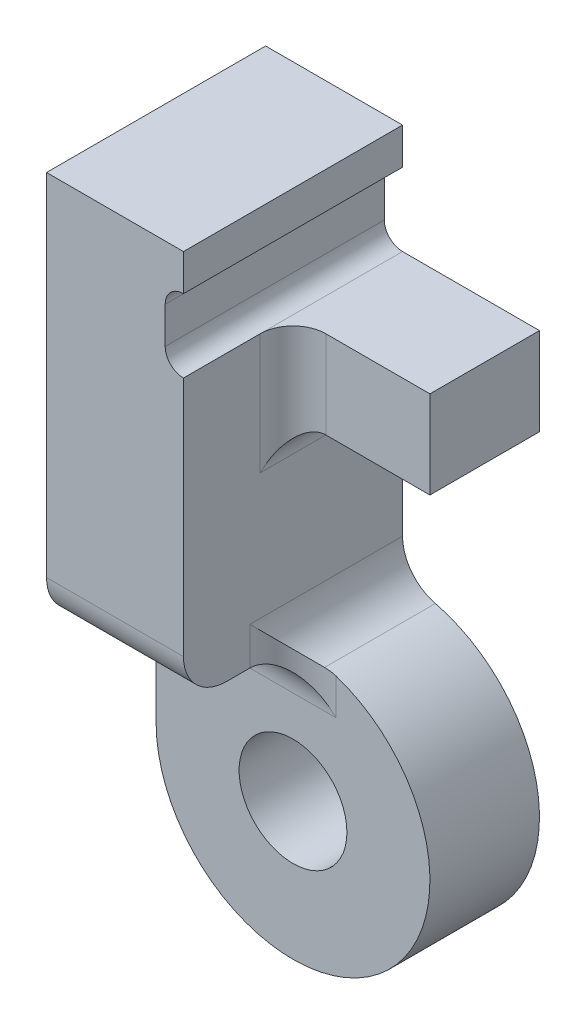
ISO-10303-21;
HEADER;
FILE_DESCRIPTION(('STEP AP214'),'2;1');
FILE_NAME('part.step','',(''),(''),'','','');
FILE_SCHEMA(('AUTOMOTIVE_DESIGN { 1 0 10303 214 1 1 1 1 }'));
ENDSEC;
DATA;
#1=APPLICATION_CONTEXT('core data for automotive mechanical design processes');
#2=APPLICATION_PROTOCOL_DEFINITION('international standard','automotive_design',2000,#1);
#3=PRODUCT_CONTEXT('',#1,'mechanical');
#4=PRODUCT('Part','Part','',(#3));
#5=PRODUCT_RELATED_PRODUCT_CATEGORY('part','',(#4));
#6=PRODUCT_DEFINITION_FORMATION('','',#4);
#7=PRODUCT_DEFINITION_CONTEXT('part definition',#1,'design');
#8=PRODUCT_DEFINITION('design','',#6,#7);
#9=PRODUCT_DEFINITION_SHAPE('','',#8);
#10=(LENGTH_UNIT() NAMED_UNIT(*) SI_UNIT(.MILLI.,.METRE.));
#11=(NAMED_UNIT(*) PLANE_ANGLE_UNIT() SI_UNIT($,.RADIAN.));
#12=(NAMED_UNIT(*) SI_UNIT($,.STERADIAN.) SOLID_ANGLE_UNIT());
#13=UNCERTAINTY_MEASURE_WITH_UNIT(LENGTH_MEASURE(1.E-05),#10,'distance_accuracy_value','');
#14=(GEOMETRIC_REPRESENTATION_CONTEXT(3) GLOBAL_UNCERTAINTY_ASSIGNED_CONTEXT((#13)) GLOBAL_UNIT_ASSIGNED_CONTEXT((#10,
#11,#12)) REPRESENTATION_CONTEXT('',''));
#15=CARTESIAN_POINT('',(0.,0.,0.));
#16=DIRECTION('',(0.,0.,1.));
#17=DIRECTION('',(1.,0.,0.));
#18=AXIS2_PLACEMENT_3D('',#15,#16,#17);
#19=CARTESIAN_POINT('',(0.,12.30900002,5.08));
#20=DIRECTION('',(-1.,0.,0.));
#21=DIRECTION('',(0.,-1.,0.));
#22=AXIS2_PLACEMENT_3D('',#19,#20,#21);
#23=PLANE('',#22);
#24=DIRECTION('',(0.,1.,0.));
#25=VECTOR('',#24,1.);
#26=CARTESIAN_POINT('',(0.,12.30900002,5.08));
#27=LINE('',#26,#25);
#28=CARTESIAN_POINT('',(0.,11.4623333533333,5.08));
#29=VERTEX_POINT('',#28);
#30=CARTESIAN_POINT('',(0.,12.30900002,5.08));
#31=VERTEX_POINT('',#30);
#32=EDGE_CURVE('E235',#29,#31,#27,.T.);
#33=ORIENTED_EDGE('',*,*,#32,.F.);
#34=DIRECTION('',(0.,0.,-1.));
#35=VECTOR('',#34,1.);
#36=CARTESIAN_POINT('',(0.,11.4623333533333,5.081));
#37=LINE('',#36,#35);
#38=CARTESIAN_POINT('',(0.,11.4623333533333,0.));
#39=VERTEX_POINT('',#38);
#40=EDGE_CURVE('E220',#39,#29,#37,.F.);
#41=ORIENTED_EDGE('',*,*,#40,.F.);
#42=DIRECTION('',(0.,1.,0.));
#43=VECTOR('',#42,1.);
#44=CARTESIAN_POINT('',(0.,12.30900002,0.));
#45=LINE('',#44,#43);
#46=CARTESIAN_POINT('',(0.,12.30900002,0.));
#47=VERTEX_POINT('',#46);
#48=EDGE_CURVE('E233',#39,#47,#45,.T.);
#49=ORIENTED_EDGE('',*,*,#48,.T.);
#50=DIRECTION('',(0.,0.,-1.));
#51=VECTOR('',#50,1.);
#52=CARTESIAN_POINT('',(0.,12.30900002,5.08));
#53=LINE('',#52,#51);
#54=EDGE_CURVE('E261',#31,#47,#53,.T.);
#55=ORIENTED_EDGE('',*,*,#54,.F.);
#56=EDGE_LOOP('',(#33,#41,#49,#55));
#57=FACE_BOUND('',#56,.T.);
#58=ADVANCED_FACE('F33',(#57),#23,.F.);
#59=CARTESIAN_POINT('',(0.,0.,5.08));
#60=DIRECTION('',(0.,0.,1.));
#61=DIRECTION('',(1.,0.,0.));
#62=AXIS2_PLACEMENT_3D('',#59,#60,#61);
#63=PLANE('',#62);
#64=DIRECTION('',(0.,-1.,0.));
#65=VECTOR('',#64,1.);
#66=CARTESIAN_POINT('',(-3.175,0.,5.08));
#67=LINE('',#66,#65);
#68=CARTESIAN_POINT('',(-3.175,12.30900002,5.08));
#69=VERTEX_POINT('',#68);
#70=CARTESIAN_POINT('',(-3.175,4.175,5.08));
#71=VERTEX_POINT('',#70);
#72=EDGE_CURVE('E258',#69,#71,#67,.T.);
#73=ORIENTED_EDGE('',*,*,#72,.T.);
#74=DIRECTION('',(-1.,0.,0.));
#75=VECTOR('',#74,1.);
#76=CARTESIAN_POINT('',(0.,4.175,5.08));
#77=LINE('',#76,#75);
#78=CARTESIAN_POINT('',(0.,4.175,5.08));
#79=VERTEX_POINT('',#78);
#80=EDGE_CURVE('E331',#71,#79,#77,.F.);
#81=ORIENTED_EDGE('',*,*,#80,.T.);
#82=CARTESIAN_POINT('',(0.,9.76900002,5.08));
#83=VERTEX_POINT('',#82);
#84=EDGE_CURVE('E522',#79,#83,#27,.T.);
#85=ORIENTED_EDGE('',*,*,#84,.T.);
#86=CARTESIAN_POINT('',(0.,10.1923333533333,5.08));
#87=DIRECTION('',(0.,0.,1.));
#88=DIRECTION('',(1.,0.,0.));
#89=AXIS2_PLACEMENT_3D('',#86,#87,#88);
#90=CIRCLE('',#89,0.423333333333334);
#91=CARTESIAN_POINT('',(-0.423333333333334,10.1923333533333,5.08));
#92=VERTEX_POINT('',#91);
#93=EDGE_CURVE('E457',#83,#92,#90,.F.);
#94=ORIENTED_EDGE('',*,*,#93,.T.);
#95=DIRECTION('',(0.,1.,0.));
#96=VECTOR('',#95,1.);
#97=CARTESIAN_POINT('',(-0.423333333333334,11.03900002,5.08));
#98=LINE('',#97,#96);
#99=CARTESIAN_POINT('',(-0.423333333333334,11.03900002,5.08));
#100=VERTEX_POINT('',#99);
#101=EDGE_CURVE('E236',#92,#100,#98,.T.);
#102=ORIENTED_EDGE('',*,*,#101,.T.);
#103=CARTESIAN_POINT('',(0.,11.03900002,5.08));
#104=DIRECTION('',(0.,0.,1.));
#105=DIRECTION('',(1.,0.,0.));
#106=AXIS2_PLACEMENT_3D('',#103,#104,#105);
#107=CIRCLE('',#106,0.423333333333334);
#108=EDGE_CURVE('E228',#100,#29,#107,.F.);
#109=ORIENTED_EDGE('',*,*,#108,.T.);
#110=ORIENTED_EDGE('',*,*,#32,.T.);
#111=DIRECTION('',(-1.,0.,0.));
#112=VECTOR('',#111,1.);
#113=CARTESIAN_POINT('',(-3.175,12.30900002,5.08));
#114=LINE('',#113,#112);
#115=EDGE_CURVE('E524',#31,#69,#114,.T.);
#116=ORIENTED_EDGE('',*,*,#115,.T.);
#117=EDGE_LOOP('',(#73,#81,#85,#94,#102,#109,#110,#116));
#118=FACE_BOUND('',#117,.T.);
#119=ADVANCED_FACE('F361',(#118),#63,.T.);
#120=CARTESIAN_POINT('',(0.,0.,5.08));
#121=DIRECTION('',(0.,0.,-1.));
#122=DIRECTION('',(-1.,0.,0.));
#123=AXIS2_PLACEMENT_3D('',#120,#121,#122);
#124=CYLINDRICAL_SURFACE('',#123,3.175);
#125=CARTESIAN_POINT('',(0.,0.,0.));
#126=DIRECTION('',(0.,0.,1.));
#127=DIRECTION('',(1.,0.,0.));
#128=AXIS2_PLACEMENT_3D('',#125,#126,#127);
#129=CIRCLE('',#128,3.175);
#130=CARTESIAN_POINT('',(-3.175,0.,0.));
#131=VERTEX_POINT('',#130);
#132=CARTESIAN_POINT('',(0.760479041916168,3.08257954103479,0.));
#133=VERTEX_POINT('',#132);
#134=EDGE_CURVE('E245',#131,#133,#129,.T.);
#135=ORIENTED_EDGE('',*,*,#134,.T.);
#136=DIRECTION('',(0.,0.,-1.));
#137=VECTOR('',#136,1.);
#138=CARTESIAN_POINT('',(0.760479041916168,3.08257954103479,5.08));
#139=LINE('',#138,#137);
#140=CARTESIAN_POINT('',(0.760479041916168,3.08257954103479,2.56910880597329));
#141=VERTEX_POINT('',#140);
#142=EDGE_CURVE('E49',#133,#141,#139,.F.);
#143=ORIENTED_EDGE('',*,*,#142,.T.);
#144=CARTESIAN_POINT('',(0.760479041916168,3.08257954103479,2.56910880597329));
#145=CARTESIAN_POINT('',(0.780317963724978,3.07768627749126,2.56421341821076));
#146=CARTESIAN_POINT('',(0.80025299046266,3.07256405721821,2.55994155083488));
#147=CARTESIAN_POINT('',(0.84015372190689,3.06189319968671,2.55265084580708));
#148=CARTESIAN_POINT('',(0.860119018164366,3.05634626700073,2.54962728152229));
#149=CARTESIAN_POINT('',(0.900071162405368,3.04482005823775,2.54480195658036));
#150=CARTESIAN_POINT('',(0.920058009790575,3.03884079387378,2.54300016283588));
#151=CARTESIAN_POINT('',(0.960052532742697,3.02644439034898,2.54059643929719));
#152=CARTESIAN_POINT('',(0.980059994028061,3.02002565926557,2.53999913937271));
#153=CARTESIAN_POINT('',(1.,3.01340753964677,2.54));
#154=B_SPLINE_CURVE_WITH_KNOTS('',3,(#144,#145,#146,#147,#148,#149,#150,#151,#152,#153),
.UNSPECIFIED.,.F.,.F.,(4,2,2,2,4),(0.,0.0630227253916922,0.125804580232714,0.188584734781046,
0.251605749093955),.UNSPECIFIED.);
#155=CARTESIAN_POINT('',(1.,3.01340753964677,2.54));
#156=VERTEX_POINT('',#155);
#157=EDGE_CURVE('E11',#141,#156,#154,.T.);
#158=ORIENTED_EDGE('',*,*,#157,.T.);
#159=CARTESIAN_POINT('',(0.,0.,2.54));
#160=DIRECTION('',(0.,0.,1.));
#161=DIRECTION('',(1.,0.,0.));
#162=AXIS2_PLACEMENT_3D('',#159,#160,#161);
#163=CIRCLE('',#162,3.175);
#164=CARTESIAN_POINT('',(-3.175,0.,2.54));
#165=VERTEX_POINT('',#164);
#166=EDGE_CURVE('E510',#165,#156,#163,.T.);
#167=ORIENTED_EDGE('',*,*,#166,.F.);
#168=DIRECTION('',(0.,0.,-1.));
#169=VECTOR('',#168,1.);
#170=CARTESIAN_POINT('',(-3.175,0.,5.08));
#171=LINE('',#170,#169);
#172=EDGE_CURVE('E255',#165,#131,#171,.T.);
#173=ORIENTED_EDGE('',*,*,#172,.T.);
#174=EDGE_LOOP('',(#135,#143,#158,#167,#173));
#175=FACE_BOUND('',#174,.T.);
#176=ADVANCED_FACE('F355',(#175),#124,.T.);
#177=CARTESIAN_POINT('',(-3.175,0.,5.08));
#178=DIRECTION('',(1.,0.,0.));
#179=DIRECTION('',(0.,0.,-1.));
#180=AXIS2_PLACEMENT_3D('',#177,#178,#179);
#181=PLANE('',#180);
#182=DIRECTION('',(0.,0.,-1.));
#183=VECTOR('',#182,1.);
#184=CARTESIAN_POINT('',(-3.175,3.175,5.081));
#185=LINE('',#184,#183);
#186=CARTESIAN_POINT('',(-3.175,3.175,4.08));
#187=VERTEX_POINT('',#186);
#188=CARTESIAN_POINT('',(-3.175,3.175,3.556));
#189=VERTEX_POINT('',#188);
#190=EDGE_CURVE('E515',#187,#189,#185,.T.);
#191=ORIENTED_EDGE('',*,*,#190,.F.);
#192=CARTESIAN_POINT('',(-3.175,4.175,4.08));
#193=DIRECTION('',(1.,0.,0.));
#194=DIRECTION('',(0.,0.,-1.));
#195=AXIS2_PLACEMENT_3D('',#192,#193,#194);
#196=CIRCLE('',#195,1.);
#197=EDGE_CURVE('E329',#187,#71,#196,.F.);
#198=ORIENTED_EDGE('',*,*,#197,.T.);
#199=ORIENTED_EDGE('',*,*,#72,.F.);
#200=DIRECTION('',(0.,0.,-1.));
#201=VECTOR('',#200,1.);
#202=CARTESIAN_POINT('',(-3.175,12.30900002,5.08));
#203=LINE('',#202,#201);
#204=CARTESIAN_POINT('',(-3.175,12.30900002,0.));
#205=VERTEX_POINT('',#204);
#206=EDGE_CURVE('E257',#69,#205,#203,.T.);
#207=ORIENTED_EDGE('',*,*,#206,.T.);
#208=DIRECTION('',(0.,-1.,0.));
#209=VECTOR('',#208,1.);
#210=CARTESIAN_POINT('',(-3.175,0.,0.));
#211=LINE('',#210,#209);
#212=EDGE_CURVE('E252',#205,#131,#211,.T.);
#213=ORIENTED_EDGE('',*,*,#212,.T.);
#214=ORIENTED_EDGE('',*,*,#172,.F.);
#215=DIRECTION('',(0.,-1.,0.));
#216=VECTOR('',#215,1.);
#217=CARTESIAN_POINT('',(-3.175,3.175,2.54));
#218=LINE('',#217,#216);
#219=CARTESIAN_POINT('',(-3.175,3.20955389820755,2.54));
#220=VERTEX_POINT('',#219);
#221=EDGE_CURVE('E513',#220,#165,#218,.T.);
#222=ORIENTED_EDGE('',*,*,#221,.F.);
#223=CARTESIAN_POINT('',(-3.175,3.20955389820755,1.397));
#224=DIRECTION('',(1.,0.,0.));
#225=DIRECTION('',(0.,0.,-1.));
#226=AXIS2_PLACEMENT_3D('',#223,#224,#225);
#227=CIRCLE('',#226,1.143);
#228=CARTESIAN_POINT('',(-3.175,3.788815989794,2.38234482758621));
#229=VERTEX_POINT('',#228);
#230=EDGE_CURVE('E269',#220,#229,#227,.F.);
#231=ORIENTED_EDGE('',*,*,#230,.T.);
#232=CARTESIAN_POINT('',(-3.175,5.07606508220834,4.572));
#233=DIRECTION('',(1.,0.,0.));
#234=DIRECTION('',(0.,0.,-1.));
#235=AXIS2_PLACEMENT_3D('',#232,#233,#234);
#236=CIRCLE('',#235,2.54);
#237=CARTESIAN_POINT('',(-3.175,5.07606508220834,2.032));
#238=VERTEX_POINT('',#237);
#239=EDGE_CURVE('E282',#229,#238,#236,.T.);
#240=ORIENTED_EDGE('',*,*,#239,.T.);
#241=DIRECTION('',(0.,-1.,0.));
#242=VECTOR('',#241,1.);
#243=CARTESIAN_POINT('',(-3.175,11.29300002,2.032));
#244=LINE('',#243,#242);
#245=CARTESIAN_POINT('',(-3.175,11.29300002,2.032));
#246=VERTEX_POINT('',#245);
#247=EDGE_CURVE('E488',#246,#238,#244,.T.);
#248=ORIENTED_EDGE('',*,*,#247,.F.);
#249=DIRECTION('',(0.,0.,-1.));
#250=VECTOR('',#249,1.);
#251=CARTESIAN_POINT('',(-3.175,11.29300002,3.048));
#252=LINE('',#251,#250);
#253=CARTESIAN_POINT('',(-3.175,11.29300002,3.048));
#254=VERTEX_POINT('',#253);
#255=EDGE_CURVE('E503',#254,#246,#252,.T.);
#256=ORIENTED_EDGE('',*,*,#255,.F.);
#257=DIRECTION('',(0.,1.,0.));
#258=VECTOR('',#257,1.);
#259=CARTESIAN_POINT('',(-3.175,4.191,3.048));
#260=LINE('',#259,#258);
#261=CARTESIAN_POINT('',(-3.175,5.207,3.048));
#262=VERTEX_POINT('',#261);
#263=EDGE_CURVE('E501',#262,#254,#260,.T.);
#264=ORIENTED_EDGE('',*,*,#263,.F.);
#265=CARTESIAN_POINT('',(-3.175,5.207,5.588));
#266=DIRECTION('',(1.,0.,0.));
#267=DIRECTION('',(0.,0.,-1.));
#268=AXIS2_PLACEMENT_3D('',#265,#266,#267);
#269=CIRCLE('',#268,2.54);
#270=CARTESIAN_POINT('',(-3.175,3.91975090758567,3.39834482758621));
#271=VERTEX_POINT('',#270);
#272=EDGE_CURVE('E287',#262,#271,#269,.F.);
#273=ORIENTED_EDGE('',*,*,#272,.T.);
#274=CARTESIAN_POINT('',(-3.175,3.34048881599922,2.413));
#275=DIRECTION('',(1.,0.,0.));
#276=DIRECTION('',(0.,0.,-1.));
#277=AXIS2_PLACEMENT_3D('',#274,#275,#276);
#278=CIRCLE('',#277,1.143);
#279=CARTESIAN_POINT('',(-3.175,3.34048881599922,3.556));
#280=VERTEX_POINT('',#279);
#281=EDGE_CURVE('E299',#271,#280,#278,.T.);
#282=ORIENTED_EDGE('',*,*,#281,.T.);
#283=DIRECTION('',(0.,1.,0.));
#284=VECTOR('',#283,1.);
#285=CARTESIAN_POINT('',(-3.175,3.683,3.556));
#286=LINE('',#285,#284);
#287=EDGE_CURVE('E484',#189,#280,#286,.T.);
#288=ORIENTED_EDGE('',*,*,#287,.F.);
#289=EDGE_LOOP('',(#191,#198,#199,#207,#213,#214,#222,#231,#240,#248,#256,#264,#273,#282,#288));
#290=FACE_BOUND('',#289,.T.);
#291=ADVANCED_FACE('F360',(#290),#181,.F.);
#292=CARTESIAN_POINT('',(0.,0.,5.08));
#293=DIRECTION('',(0.,0.,-1.));
#294=DIRECTION('',(-1.,0.,0.));
#295=AXIS2_PLACEMENT_3D('',#292,#293,#294);
#296=CYLINDRICAL_SURFACE('',#295,1.25);
#297=CARTESIAN_POINT('',(0.,0.,0.));
#298=DIRECTION('',(0.,0.,1.));
#299=DIRECTION('',(1.,0.,0.));
#300=AXIS2_PLACEMENT_3D('',#297,#298,#299);
#301=CIRCLE('',#300,1.25);
#302=CARTESIAN_POINT('',(1.25,0.,0.));
#303=VERTEX_POINT('',#302);
#304=EDGE_CURVE('E247',#303,#303,#301,.T.);
#305=ORIENTED_EDGE('',*,*,#304,.F.);
#306=EDGE_LOOP('',(#305));
#307=FACE_BOUND('',#306,.T.);
#308=CARTESIAN_POINT('',(0.,0.,2.54));
#309=DIRECTION('',(0.,0.,1.));
#310=DIRECTION('',(1.,0.,0.));
#311=AXIS2_PLACEMENT_3D('',#308,#309,#310);
#312=CIRCLE('',#311,1.25);
#313=CARTESIAN_POINT('',(1.25,0.,2.54));
#314=VERTEX_POINT('',#313);
#315=EDGE_CURVE('E517',#314,#314,#312,.F.);
#316=ORIENTED_EDGE('',*,*,#315,.F.);
#317=EDGE_LOOP('',(#316));
#318=FACE_BOUND('',#317,.T.);
#319=ADVANCED_FACE('F427',(#307,#318),#296,.F.);
#320=CARTESIAN_POINT('',(0.,0.,0.));
#321=DIRECTION('',(0.,0.,1.));
#322=DIRECTION('',(1.,0.,0.));
#323=AXIS2_PLACEMENT_3D('',#320,#321,#322);
#324=PLANE('',#323);
#325=ORIENTED_EDGE('',*,*,#48,.F.);
#326=CARTESIAN_POINT('',(0.,11.03900002,0.));
#327=DIRECTION('',(0.,0.,-1.));
#328=DIRECTION('',(-1.,0.,0.));
#329=AXIS2_PLACEMENT_3D('',#326,#327,#328);
#330=CIRCLE('',#329,0.423333333333334);
#331=CARTESIAN_POINT('',(-0.423333333333334,11.03900002,0.));
#332=VERTEX_POINT('',#331);
#333=EDGE_CURVE('E216',#332,#39,#330,.T.);
#334=ORIENTED_EDGE('',*,*,#333,.F.);
#335=DIRECTION('',(0.,1.,0.));
#336=VECTOR('',#335,1.);
#337=CARTESIAN_POINT('',(-0.423333333333334,11.03900002,0.));
#338=LINE('',#337,#336);
#339=CARTESIAN_POINT('',(-0.423333333333334,10.1923333533333,0.));
#340=VERTEX_POINT('',#339);
#341=EDGE_CURVE('E453',#340,#332,#338,.T.);
#342=ORIENTED_EDGE('',*,*,#341,.F.);
#343=CARTESIAN_POINT('',(0.,10.1923333533333,0.));
#344=DIRECTION('',(0.,0.,-1.));
#345=DIRECTION('',(-1.,0.,0.));
#346=AXIS2_PLACEMENT_3D('',#343,#344,#345);
#347=CIRCLE('',#346,0.423333333333334);
#348=CARTESIAN_POINT('',(0.,9.76900002,0.));
#349=VERTEX_POINT('',#348);
#350=EDGE_CURVE('E227',#349,#340,#347,.T.);
#351=ORIENTED_EDGE('',*,*,#350,.F.);
#352=DIRECTION('',(1.,0.,0.));
#353=VECTOR('',#352,1.);
#354=CARTESIAN_POINT('',(3.175,9.76900002,0.));
#355=LINE('',#354,#353);
#356=CARTESIAN_POINT('',(3.175,9.76900002,0.));
#357=VERTEX_POINT('',#356);
#358=EDGE_CURVE('E461',#349,#357,#355,.T.);
#359=ORIENTED_EDGE('',*,*,#358,.T.);
#360=DIRECTION('',(0.,-1.,0.));
#361=VECTOR('',#360,1.);
#362=CARTESIAN_POINT('',(3.175,7.73700002,0.));
#363=LINE('',#362,#361);
#364=CARTESIAN_POINT('',(3.175,7.73700002,0.));
#365=VERTEX_POINT('',#364);
#366=EDGE_CURVE('E466',#357,#365,#363,.T.);
#367=ORIENTED_EDGE('',*,*,#366,.T.);
#368=DIRECTION('',(-1.,0.,0.));
#369=VECTOR('',#368,1.);
#370=CARTESIAN_POINT('',(0.,7.73700002,0.));
#371=LINE('',#370,#369);
#372=CARTESIAN_POINT('',(0.762,7.73700002,0.));
#373=VERTEX_POINT('',#372);
#374=EDGE_CURVE('E462',#365,#373,#371,.T.);
#375=ORIENTED_EDGE('',*,*,#374,.T.);
#376=CARTESIAN_POINT('',(0.762,6.97500002,0.));
#377=DIRECTION('',(0.,0.,1.));
#378=DIRECTION('',(1.,0.,0.));
#379=AXIS2_PLACEMENT_3D('',#376,#377,#378);
#380=CIRCLE('',#379,0.762);
#381=CARTESIAN_POINT('',(0.,6.97500002,0.));
#382=VERTEX_POINT('',#381);
#383=EDGE_CURVE('E313',#373,#382,#380,.T.);
#384=ORIENTED_EDGE('',*,*,#383,.T.);
#385=CARTESIAN_POINT('',(0.,4.0534707350615,0.));
#386=VERTEX_POINT('',#385);
#387=EDGE_CURVE('E244',#386,#382,#45,.T.);
#388=ORIENTED_EDGE('',*,*,#387,.F.);
#389=CARTESIAN_POINT('',(1.,4.0534707350615,0.));
#390=DIRECTION('',(0.,0.,1.));
#391=DIRECTION('',(1.,0.,0.));
#392=AXIS2_PLACEMENT_3D('',#389,#390,#391);
#393=CIRCLE('',#392,1.);
#394=EDGE_CURVE('E337',#386,#133,#393,.T.);
#395=ORIENTED_EDGE('',*,*,#394,.T.);
#396=ORIENTED_EDGE('',*,*,#134,.F.);
#397=ORIENTED_EDGE('',*,*,#212,.F.);
#398=DIRECTION('',(-1.,0.,0.));
#399=VECTOR('',#398,1.);
#400=CARTESIAN_POINT('',(-3.175,12.30900002,0.));
#401=LINE('',#400,#399);
#402=EDGE_CURVE('E243',#47,#205,#401,.T.);
#403=ORIENTED_EDGE('',*,*,#402,.F.);
#404=EDGE_LOOP('',(#325,#334,#342,#351,#359,#367,#375,#384,#388,#395,#396,#397,#403));
#405=FACE_BOUND('',#404,.T.);
#406=ORIENTED_EDGE('',*,*,#304,.T.);
#407=EDGE_LOOP('',(#406));
#408=FACE_BOUND('',#407,.T.);
#409=ADVANCED_FACE('F240',(#405,#408),#324,.F.);
#410=DIRECTION('',(0.,0.,-1.));
#411=VECTOR('',#410,1.);
#412=CARTESIAN_POINT('',(0.,3.175,5.08));
#413=LINE('',#412,#411);
#414=CARTESIAN_POINT('',(0.,3.175,4.08));
#415=VERTEX_POINT('',#414);
#416=CARTESIAN_POINT('',(0.,3.175,3.54));
#417=VERTEX_POINT('',#416);
#418=EDGE_CURVE('E263',#415,#417,#413,.T.);
#419=ORIENTED_EDGE('',*,*,#418,.T.);
#420=DIRECTION('',(0.,1.,0.));
#421=VECTOR('',#420,1.);
#422=CARTESIAN_POINT('',(0.,12.30900002,3.54));
#423=LINE('',#422,#421);
#424=CARTESIAN_POINT('',(0.,4.0534707350615,3.54));
#425=VERTEX_POINT('',#424);
#426=EDGE_CURVE('E346',#417,#425,#423,.T.);
#427=ORIENTED_EDGE('',*,*,#426,.T.);
#428=DIRECTION('',(0.,0.,1.));
#429=VECTOR('',#428,1.);
#430=CARTESIAN_POINT('',(0.,4.0534707350615,0.));
#431=LINE('',#430,#429);
#432=EDGE_CURVE('E56',#425,#386,#431,.F.);
#433=ORIENTED_EDGE('',*,*,#432,.T.);
#434=ORIENTED_EDGE('',*,*,#387,.T.);
#435=DIRECTION('',(0.,0.,-1.));
#436=VECTOR('',#435,1.);
#437=CARTESIAN_POINT('',(0.,6.97500002,5.08));
#438=LINE('',#437,#436);
#439=CARTESIAN_POINT('',(0.,6.97500002,3.302));
#440=VERTEX_POINT('',#439);
#441=EDGE_CURVE('E311',#382,#440,#438,.F.);
#442=ORIENTED_EDGE('',*,*,#441,.T.);
#443=DIRECTION('',(0.,1.,0.));
#444=VECTOR('',#443,1.);
#445=CARTESIAN_POINT('',(0.,12.30900002,3.302));
#446=LINE('',#445,#444);
#447=CARTESIAN_POINT('',(0.,9.76900002,3.302));
#448=VERTEX_POINT('',#447);
#449=EDGE_CURVE('E316',#440,#448,#446,.T.);
#450=ORIENTED_EDGE('',*,*,#449,.T.);
#451=DIRECTION('',(0.,0.,-1.));
#452=VECTOR('',#451,1.);
#453=CARTESIAN_POINT('',(0.,9.76900002,5.081));
#454=LINE('',#453,#452);
#455=EDGE_CURVE('E237',#83,#448,#454,.T.);
#456=ORIENTED_EDGE('',*,*,#455,.F.);
#457=ORIENTED_EDGE('',*,*,#84,.F.);
#458=CARTESIAN_POINT('',(0.,4.175,4.08));
#459=DIRECTION('',(-1.,0.,0.));
#460=DIRECTION('',(0.,-1.,0.));
#461=AXIS2_PLACEMENT_3D('',#458,#459,#460);
#462=CIRCLE('',#461,1.);
#463=EDGE_CURVE('E333',#79,#415,#462,.F.);
#464=ORIENTED_EDGE('',*,*,#463,.T.);
#465=EDGE_LOOP('',(#419,#427,#433,#434,#442,#450,#456,#457,#464));
#466=FACE_BOUND('',#465,.T.);
#467=ADVANCED_FACE('F362',(#466),#23,.F.);
#468=CARTESIAN_POINT('',(-3.175,12.30900002,5.08));
#469=DIRECTION('',(0.,-1.,0.));
#470=DIRECTION('',(0.,0.,-1.));
#471=AXIS2_PLACEMENT_3D('',#468,#469,#470);
#472=PLANE('',#471);
#473=ORIENTED_EDGE('',*,*,#402,.T.);
#474=ORIENTED_EDGE('',*,*,#206,.F.);
#475=ORIENTED_EDGE('',*,*,#115,.F.);
#476=ORIENTED_EDGE('',*,*,#54,.T.);
#477=EDGE_LOOP('',(#473,#474,#475,#476));
#478=FACE_BOUND('',#477,.T.);
#479=ADVANCED_FACE('F418',(#478),#472,.F.);
#480=CARTESIAN_POINT('',(0.,3.175,5.081));
#481=DIRECTION('',(0.,-1.,0.));
#482=DIRECTION('',(1.,0.,0.));
#483=AXIS2_PLACEMENT_3D('',#480,#481,#482);
#484=PLANE('',#483);
#485=DIRECTION('',(0.,0.,1.));
#486=VECTOR('',#485,1.);
#487=CARTESIAN_POINT('',(-2.159,3.175,3.556));
#488=LINE('',#487,#486);
#489=CARTESIAN_POINT('',(-2.159,3.175,3.54));
#490=VERTEX_POINT('',#489);
#491=CARTESIAN_POINT('',(-2.159,3.175,3.556));
#492=VERTEX_POINT('',#491);
#493=EDGE_CURVE('E485',#490,#492,#488,.T.);
#494=ORIENTED_EDGE('',*,*,#493,.F.);
#495=DIRECTION('',(-1.,0.,0.));
#496=VECTOR('',#495,1.);
#497=CARTESIAN_POINT('',(0.,3.175,3.54));
#498=LINE('',#497,#496);
#499=EDGE_CURVE('E344',#490,#417,#498,.F.);
#500=ORIENTED_EDGE('',*,*,#499,.T.);
#501=ORIENTED_EDGE('',*,*,#418,.F.);
#502=DIRECTION('',(-1.,0.,0.));
#503=VECTOR('',#502,1.);
#504=CARTESIAN_POINT('',(0.,3.175,4.08));
#505=LINE('',#504,#503);
#506=EDGE_CURVE('E326',#415,#187,#505,.T.);
#507=ORIENTED_EDGE('',*,*,#506,.T.);
#508=ORIENTED_EDGE('',*,*,#190,.T.);
#509=DIRECTION('',(-1.,0.,0.));
#510=VECTOR('',#509,1.);
#511=CARTESIAN_POINT('',(-2.159,3.175,3.556));
#512=LINE('',#511,#510);
#513=EDGE_CURVE('E498',#492,#189,#512,.T.);
#514=ORIENTED_EDGE('',*,*,#513,.F.);
#515=EDGE_LOOP('',(#494,#500,#501,#507,#508,#514));
#516=FACE_BOUND('',#515,.T.);
#517=ADVANCED_FACE('F424',(#516),#484,.T.);
#518=CARTESIAN_POINT('',(0.,0.,2.54));
#519=DIRECTION('',(0.,0.,1.));
#520=DIRECTION('',(1.,0.,0.));
#521=AXIS2_PLACEMENT_3D('',#518,#519,#520);
#522=PLANE('',#521);
#523=ORIENTED_EDGE('',*,*,#315,.T.);
#524=EDGE_LOOP('',(#523));
#525=FACE_BOUND('',#524,.T.);
#526=DIRECTION('',(-1.,0.,0.));
#527=VECTOR('',#526,1.);
#528=CARTESIAN_POINT('',(-2.159,2.175,2.54));
#529=LINE('',#528,#527);
#530=CARTESIAN_POINT('',(1.,2.175,2.54));
#531=VERTEX_POINT('',#530);
#532=CARTESIAN_POINT('',(-2.159,2.175,2.54));
#533=VERTEX_POINT('',#532);
#534=EDGE_CURVE('E341',#531,#533,#529,.T.);
#535=ORIENTED_EDGE('',*,*,#534,.T.);
#536=DIRECTION('',(0.,-1.,0.));
#537=VECTOR('',#536,1.);
#538=CARTESIAN_POINT('',(-2.159,3.175,2.54));
#539=LINE('',#538,#537);
#540=CARTESIAN_POINT('',(-2.159,3.20955389820755,2.54));
#541=VERTEX_POINT('',#540);
#542=EDGE_CURVE('E496',#541,#533,#539,.T.);
#543=ORIENTED_EDGE('',*,*,#542,.F.);
#544=DIRECTION('',(-1.,0.,0.));
#545=VECTOR('',#544,1.);
#546=CARTESIAN_POINT('',(-3.175,3.20955389820755,2.54));
#547=LINE('',#546,#545);
#548=EDGE_CURVE('E266',#541,#220,#547,.T.);
#549=ORIENTED_EDGE('',*,*,#548,.T.);
#550=ORIENTED_EDGE('',*,*,#221,.T.);
#551=ORIENTED_EDGE('',*,*,#166,.T.);
#552=DIRECTION('',(0.,1.,0.));
#553=VECTOR('',#552,1.);
#554=CARTESIAN_POINT('',(1.,0.,2.54));
#555=LINE('',#554,#553);
#556=EDGE_CURVE('E339',#156,#531,#555,.F.);
#557=ORIENTED_EDGE('',*,*,#556,.T.);
#558=EDGE_LOOP('',(#535,#543,#549,#550,#551,#557));
#559=FACE_BOUND('',#558,.T.);
#560=ADVANCED_FACE('F563',(#525,#559),#522,.T.);
#561=CARTESIAN_POINT('',(-2.159,11.29300002,2.032));
#562=DIRECTION('',(0.,0.,-1.));
#563=DIRECTION('',(0.,1.,0.));
#564=AXIS2_PLACEMENT_3D('',#561,#562,#563);
#565=PLANE('',#564);
#566=DIRECTION('',(0.,-1.,0.));
#567=VECTOR('',#566,1.);
#568=CARTESIAN_POINT('',(-2.159,11.29300002,2.032));
#569=LINE('',#568,#567);
#570=CARTESIAN_POINT('',(-2.159,10.27700002,2.032));
#571=VERTEX_POINT('',#570);
#572=CARTESIAN_POINT('',(-2.159,5.07606508220834,2.032));
#573=VERTEX_POINT('',#572);
#574=EDGE_CURVE('E494',#571,#573,#569,.T.);
#575=ORIENTED_EDGE('',*,*,#574,.F.);
#576=CARTESIAN_POINT('',(-3.175,10.27700002,2.032));
#577=DIRECTION('',(0.,0.,-1.));
#578=DIRECTION('',(0.,1.,0.));
#579=AXIS2_PLACEMENT_3D('',#576,#577,#578);
#580=CIRCLE('',#579,1.016);
#581=EDGE_CURVE('E304',#571,#246,#580,.F.);
#582=ORIENTED_EDGE('',*,*,#581,.T.);
#583=ORIENTED_EDGE('',*,*,#247,.T.);
#584=DIRECTION('',(1.,0.,0.));
#585=VECTOR('',#584,1.);
#586=CARTESIAN_POINT('',(-2.159,5.07606508220834,2.032));
#587=LINE('',#586,#585);
#588=EDGE_CURVE('E277',#238,#573,#587,.T.);
#589=ORIENTED_EDGE('',*,*,#588,.T.);
#590=EDGE_LOOP('',(#575,#582,#583,#589));
#591=FACE_BOUND('',#590,.T.);
#592=ADVANCED_FACE('F554',(#591),#565,.F.);
#593=CARTESIAN_POINT('',(-2.159,4.191,3.048));
#594=DIRECTION('',(0.,0.,1.));
#595=DIRECTION('',(0.,-1.,0.));
#596=AXIS2_PLACEMENT_3D('',#593,#594,#595);
#597=PLANE('',#596);
#598=ORIENTED_EDGE('',*,*,#263,.T.);
#599=CARTESIAN_POINT('',(-3.175,10.27700002,3.048));
#600=DIRECTION('',(0.,0.,1.));
#601=DIRECTION('',(0.,-1.,0.));
#602=AXIS2_PLACEMENT_3D('',#599,#600,#601);
#603=CIRCLE('',#602,1.016);
#604=CARTESIAN_POINT('',(-2.159,10.27700002,3.048));
#605=VERTEX_POINT('',#604);
#606=EDGE_CURVE('E306',#254,#605,#603,.F.);
#607=ORIENTED_EDGE('',*,*,#606,.T.);
#608=DIRECTION('',(0.,1.,0.));
#609=VECTOR('',#608,1.);
#610=CARTESIAN_POINT('',(-2.159,4.191,3.048));
#611=LINE('',#610,#609);
#612=CARTESIAN_POINT('',(-2.159,5.207,3.048));
#613=VERTEX_POINT('',#612);
#614=EDGE_CURVE('E491',#613,#605,#611,.T.);
#615=ORIENTED_EDGE('',*,*,#614,.F.);
#616=DIRECTION('',(1.,0.,0.));
#617=VECTOR('',#616,1.);
#618=CARTESIAN_POINT('',(-2.159,5.207,3.048));
#619=LINE('',#618,#617);
#620=EDGE_CURVE('E284',#613,#262,#619,.F.);
#621=ORIENTED_EDGE('',*,*,#620,.T.);
#622=EDGE_LOOP('',(#598,#607,#615,#621));
#623=FACE_BOUND('',#622,.T.);
#624=ADVANCED_FACE('F547',(#623),#597,.F.);
#625=CARTESIAN_POINT('',(-2.159,3.683,3.556));
#626=DIRECTION('',(0.,0.,1.));
#627=DIRECTION('',(1.,0.,0.));
#628=AXIS2_PLACEMENT_3D('',#625,#626,#627);
#629=PLANE('',#628);
#630=ORIENTED_EDGE('',*,*,#287,.T.);
#631=DIRECTION('',(1.,0.,0.));
#632=VECTOR('',#631,1.);
#633=CARTESIAN_POINT('',(-2.159,3.34048881599922,3.556));
#634=LINE('',#633,#632);
#635=CARTESIAN_POINT('',(-2.159,3.34048881599922,3.556));
#636=VERTEX_POINT('',#635);
#637=EDGE_CURVE('E295',#280,#636,#634,.T.);
#638=ORIENTED_EDGE('',*,*,#637,.T.);
#639=DIRECTION('',(0.,1.,0.));
#640=VECTOR('',#639,1.);
#641=CARTESIAN_POINT('',(-2.159,3.683,3.556));
#642=LINE('',#641,#640);
#643=EDGE_CURVE('E487',#492,#636,#642,.T.);
#644=ORIENTED_EDGE('',*,*,#643,.F.);
#645=ORIENTED_EDGE('',*,*,#513,.T.);
#646=EDGE_LOOP('',(#630,#638,#644,#645));
#647=FACE_BOUND('',#646,.T.);
#648=ADVANCED_FACE('F537',(#647),#629,.F.);
#649=CARTESIAN_POINT('',(-2.159,0.,0.));
#650=DIRECTION('',(1.,0.,0.));
#651=DIRECTION('',(0.,0.,-1.));
#652=AXIS2_PLACEMENT_3D('',#649,#650,#651);
#653=PLANE('',#652);
#654=ORIENTED_EDGE('',*,*,#614,.T.);
#655=DIRECTION('',(0.,0.,-1.));
#656=VECTOR('',#655,1.);
#657=CARTESIAN_POINT('',(-2.159,10.27700002,2.032));
#658=LINE('',#657,#656);
#659=EDGE_CURVE('E301',#605,#571,#658,.T.);
#660=ORIENTED_EDGE('',*,*,#659,.T.);
#661=ORIENTED_EDGE('',*,*,#574,.T.);
#662=CARTESIAN_POINT('',(-2.159,5.07606508220834,4.572));
#663=DIRECTION('',(1.,0.,0.));
#664=DIRECTION('',(0.,0.,-1.));
#665=AXIS2_PLACEMENT_3D('',#662,#663,#664);
#666=CIRCLE('',#665,2.54);
#667=CARTESIAN_POINT('',(-2.159,3.788815989794,2.38234482758621));
#668=VERTEX_POINT('',#667);
#669=EDGE_CURVE('E280',#573,#668,#666,.F.);
#670=ORIENTED_EDGE('',*,*,#669,.T.);
#671=CARTESIAN_POINT('',(-2.159,3.20955389820755,1.397));
#672=DIRECTION('',(1.,0.,0.));
#673=DIRECTION('',(0.,0.,-1.));
#674=AXIS2_PLACEMENT_3D('',#671,#672,#673);
#675=CIRCLE('',#674,1.143);
#676=EDGE_CURVE('E272',#668,#541,#675,.T.);
#677=ORIENTED_EDGE('',*,*,#676,.T.);
#678=ORIENTED_EDGE('',*,*,#542,.T.);
#679=CARTESIAN_POINT('',(-2.159,2.175,3.54));
#680=DIRECTION('',(1.,0.,0.));
#681=DIRECTION('',(0.,0.,-1.));
#682=AXIS2_PLACEMENT_3D('',#679,#680,#681);
#683=CIRCLE('',#682,1.);
#684=EDGE_CURVE('E348',#533,#490,#683,.T.);
#685=ORIENTED_EDGE('',*,*,#684,.T.);
#686=ORIENTED_EDGE('',*,*,#493,.T.);
#687=ORIENTED_EDGE('',*,*,#643,.T.);
#688=CARTESIAN_POINT('',(-2.159,3.34048881599922,2.413));
#689=DIRECTION('',(1.,0.,0.));
#690=DIRECTION('',(0.,0.,-1.));
#691=AXIS2_PLACEMENT_3D('',#688,#689,#690);
#692=CIRCLE('',#691,1.143);
#693=CARTESIAN_POINT('',(-2.159,3.91975090758567,3.39834482758621));
#694=VERTEX_POINT('',#693);
#695=EDGE_CURVE('E297',#636,#694,#692,.F.);
#696=ORIENTED_EDGE('',*,*,#695,.T.);
#697=CARTESIAN_POINT('',(-2.159,5.207,5.588));
#698=DIRECTION('',(1.,0.,0.));
#699=DIRECTION('',(0.,0.,-1.));
#700=AXIS2_PLACEMENT_3D('',#697,#698,#699);
#701=CIRCLE('',#700,2.54);
#702=EDGE_CURVE('E290',#694,#613,#701,.T.);
#703=ORIENTED_EDGE('',*,*,#702,.T.);
#704=EDGE_LOOP('',(#654,#660,#661,#670,#677,#678,#685,#686,#687,#696,#703));
#705=FACE_BOUND('',#704,.T.);
#706=ADVANCED_FACE('F368',(#705),#653,.F.);
#707=CARTESIAN_POINT('',(0.,3.20955389820755,1.397));
#708=DIRECTION('',(1.,0.,0.));
#709=DIRECTION('',(0.,0.,-1.));
#710=AXIS2_PLACEMENT_3D('',#707,#708,#709);
#711=CYLINDRICAL_SURFACE('',#710,1.143);
#712=ORIENTED_EDGE('',*,*,#676,.F.);
#713=DIRECTION('',(1.,0.,0.));
#714=VECTOR('',#713,1.);
#715=CARTESIAN_POINT('',(0.,3.788815989794,2.38234482758621));
#716=LINE('',#715,#714);
#717=EDGE_CURVE('E274',#668,#229,#716,.F.);
#718=ORIENTED_EDGE('',*,*,#717,.T.);
#719=ORIENTED_EDGE('',*,*,#230,.F.);
#720=ORIENTED_EDGE('',*,*,#548,.F.);
#721=EDGE_LOOP('',(#712,#718,#719,#720));
#722=FACE_BOUND('',#721,.T.);
#723=ADVANCED_FACE('F364',(#722),#711,.T.);
#724=CARTESIAN_POINT('',(0.,5.07606508220834,4.572));
#725=DIRECTION('',(1.,0.,0.));
#726=DIRECTION('',(0.,0.,-1.));
#727=AXIS2_PLACEMENT_3D('',#724,#725,#726);
#728=CYLINDRICAL_SURFACE('',#727,2.54);
#729=ORIENTED_EDGE('',*,*,#669,.F.);
#730=ORIENTED_EDGE('',*,*,#588,.F.);
#731=ORIENTED_EDGE('',*,*,#239,.F.);
#732=ORIENTED_EDGE('',*,*,#717,.F.);
#733=EDGE_LOOP('',(#729,#730,#731,#732));
#734=FACE_BOUND('',#733,.T.);
#735=ADVANCED_FACE('F367',(#734),#728,.F.);
#736=CARTESIAN_POINT('',(-2.159,5.207,5.588));
#737=DIRECTION('',(1.,0.,0.));
#738=DIRECTION('',(0.,0.,-1.));
#739=AXIS2_PLACEMENT_3D('',#736,#737,#738);
#740=CYLINDRICAL_SURFACE('',#739,2.54);
#741=ORIENTED_EDGE('',*,*,#702,.F.);
#742=DIRECTION('',(1.,0.,0.));
#743=VECTOR('',#742,1.);
#744=CARTESIAN_POINT('',(-2.159,3.91975090758567,3.39834482758621));
#745=LINE('',#744,#743);
#746=EDGE_CURVE('E292',#694,#271,#745,.F.);
#747=ORIENTED_EDGE('',*,*,#746,.T.);
#748=ORIENTED_EDGE('',*,*,#272,.F.);
#749=ORIENTED_EDGE('',*,*,#620,.F.);
#750=EDGE_LOOP('',(#741,#747,#748,#749));
#751=FACE_BOUND('',#750,.T.);
#752=ADVANCED_FACE('F372',(#751),#740,.T.);
#753=CARTESIAN_POINT('',(-2.159,3.34048881599922,2.413));
#754=DIRECTION('',(1.,0.,0.));
#755=DIRECTION('',(0.,0.,-1.));
#756=AXIS2_PLACEMENT_3D('',#753,#754,#755);
#757=CYLINDRICAL_SURFACE('',#756,1.143);
#758=ORIENTED_EDGE('',*,*,#695,.F.);
#759=ORIENTED_EDGE('',*,*,#637,.F.);
#760=ORIENTED_EDGE('',*,*,#281,.F.);
#761=ORIENTED_EDGE('',*,*,#746,.F.);
#762=EDGE_LOOP('',(#758,#759,#760,#761));
#763=FACE_BOUND('',#762,.T.);
#764=ADVANCED_FACE('F376',(#763),#757,.F.);
#765=CARTESIAN_POINT('',(-3.175,10.27700002,0.));
#766=DIRECTION('',(0.,0.,1.));
#767=DIRECTION('',(1.,0.,0.));
#768=AXIS2_PLACEMENT_3D('',#765,#766,#767);
#769=CYLINDRICAL_SURFACE('',#768,1.016);
#770=ORIENTED_EDGE('',*,*,#606,.F.);
#771=ORIENTED_EDGE('',*,*,#255,.T.);
#772=ORIENTED_EDGE('',*,*,#581,.F.);
#773=ORIENTED_EDGE('',*,*,#659,.F.);
#774=EDGE_LOOP('',(#770,#771,#772,#773));
#775=FACE_BOUND('',#774,.T.);
#776=ADVANCED_FACE('F380',(#775),#769,.F.);
#777=CARTESIAN_POINT('',(0.,0.,2.54));
#778=DIRECTION('',(0.,0.,1.));
#779=DIRECTION('',(1.,0.,0.));
#780=AXIS2_PLACEMENT_3D('',#777,#778,#779);
#781=PLANE('',#780);
#782=DIRECTION('',(1.,0.,0.));
#783=VECTOR('',#782,1.);
#784=CARTESIAN_POINT('',(3.175,9.76900002,2.54));
#785=LINE('',#784,#783);
#786=CARTESIAN_POINT('',(0.762,9.76900002,2.54));
#787=VERTEX_POINT('',#786);
#788=CARTESIAN_POINT('',(3.175,9.76900002,2.54));
#789=VERTEX_POINT('',#788);
#790=EDGE_CURVE('E465',#787,#789,#785,.T.);
#791=ORIENTED_EDGE('',*,*,#790,.F.);
#792=DIRECTION('',(0.,1.,0.));
#793=VECTOR('',#792,1.);
#794=CARTESIAN_POINT('',(0.762,0.,2.54));
#795=LINE('',#794,#793);
#796=CARTESIAN_POINT('',(0.762,7.73700002,2.54));
#797=VERTEX_POINT('',#796);
#798=EDGE_CURVE('E319',#787,#797,#795,.F.);
#799=ORIENTED_EDGE('',*,*,#798,.T.);
#800=DIRECTION('',(-1.,0.,0.));
#801=VECTOR('',#800,1.);
#802=CARTESIAN_POINT('',(0.,7.73700002,2.54));
#803=LINE('',#802,#801);
#804=CARTESIAN_POINT('',(3.175,7.73700002,2.54));
#805=VERTEX_POINT('',#804);
#806=EDGE_CURVE('E473',#805,#797,#803,.T.);
#807=ORIENTED_EDGE('',*,*,#806,.F.);
#808=DIRECTION('',(0.,-1.,0.));
#809=VECTOR('',#808,1.);
#810=CARTESIAN_POINT('',(3.175,7.73700002,2.54));
#811=LINE('',#810,#809);
#812=EDGE_CURVE('E478',#789,#805,#811,.T.);
#813=ORIENTED_EDGE('',*,*,#812,.F.);
#814=EDGE_LOOP('',(#791,#799,#807,#813));
#815=FACE_BOUND('',#814,.T.);
#816=ADVANCED_FACE('F384',(#815),#781,.T.);
#817=CARTESIAN_POINT('',(3.175,9.76900002,6.30956880823258));
#818=DIRECTION('',(0.,1.,0.));
#819=DIRECTION('',(0.,0.,1.));
#820=AXIS2_PLACEMENT_3D('',#817,#818,#819);
#821=PLANE('',#820);
#822=DIRECTION('',(0.,0.,-1.));
#823=VECTOR('',#822,1.);
#824=CARTESIAN_POINT('',(0.,9.76900002,6.30956880823258));
#825=LINE('',#824,#823);
#826=EDGE_CURVE('E476',#448,#349,#825,.T.);
#827=ORIENTED_EDGE('',*,*,#826,.F.);
#828=CARTESIAN_POINT('',(0.762,9.76900002,3.302));
#829=DIRECTION('',(0.,1.,0.));
#830=DIRECTION('',(0.,0.,1.));
#831=AXIS2_PLACEMENT_3D('',#828,#829,#830);
#832=CIRCLE('',#831,0.762);
#833=EDGE_CURVE('E321',#448,#787,#832,.F.);
#834=ORIENTED_EDGE('',*,*,#833,.T.);
#835=ORIENTED_EDGE('',*,*,#790,.T.);
#836=DIRECTION('',(0.,0.,-1.));
#837=VECTOR('',#836,1.);
#838=CARTESIAN_POINT('',(3.175,9.76900002,6.30956880823258));
#839=LINE('',#838,#837);
#840=EDGE_CURVE('E472',#789,#357,#839,.T.);
#841=ORIENTED_EDGE('',*,*,#840,.T.);
#842=ORIENTED_EDGE('',*,*,#358,.F.);
#843=EDGE_LOOP('',(#827,#834,#835,#841,#842));
#844=FACE_BOUND('',#843,.T.);
#845=ADVANCED_FACE('F577',(#844),#821,.T.);
#846=CARTESIAN_POINT('',(3.175,7.73700002,6.30956880823258));
#847=DIRECTION('',(1.,0.,0.));
#848=DIRECTION('',(0.,0.,-1.));
#849=AXIS2_PLACEMENT_3D('',#846,#847,#848);
#850=PLANE('',#849);
#851=ORIENTED_EDGE('',*,*,#840,.F.);
#852=ORIENTED_EDGE('',*,*,#812,.T.);
#853=DIRECTION('',(0.,0.,-1.));
#854=VECTOR('',#853,1.);
#855=CARTESIAN_POINT('',(3.175,7.73700002,6.30956880823258));
#856=LINE('',#855,#854);
#857=EDGE_CURVE('E477',#805,#365,#856,.T.);
#858=ORIENTED_EDGE('',*,*,#857,.T.);
#859=ORIENTED_EDGE('',*,*,#366,.F.);
#860=EDGE_LOOP('',(#851,#852,#858,#859));
#861=FACE_BOUND('',#860,.T.);
#862=ADVANCED_FACE('F585',(#861),#850,.T.);
#863=CARTESIAN_POINT('',(0.,7.73700002,6.30956880823258));
#864=DIRECTION('',(0.,-1.,0.));
#865=DIRECTION('',(0.,0.,-1.));
#866=AXIS2_PLACEMENT_3D('',#863,#864,#865);
#867=PLANE('',#866);
#868=ORIENTED_EDGE('',*,*,#806,.T.);
#869=DIRECTION('',(0.,0.,-1.));
#870=VECTOR('',#869,1.);
#871=CARTESIAN_POINT('',(0.762,7.73700002,6.30956880823258));
#872=LINE('',#871,#870);
#873=EDGE_CURVE('E308',#797,#373,#872,.T.);
#874=ORIENTED_EDGE('',*,*,#873,.T.);
#875=ORIENTED_EDGE('',*,*,#374,.F.);
#876=ORIENTED_EDGE('',*,*,#857,.F.);
#877=EDGE_LOOP('',(#868,#874,#875,#876));
#878=FACE_BOUND('',#877,.T.);
#879=ADVANCED_FACE('F389',(#878),#867,.T.);
#880=CARTESIAN_POINT('',(0.762,6.97500002,6.30956880823258));
#881=DIRECTION('',(0.,0.,-1.));
#882=DIRECTION('',(-1.,0.,0.));
#883=AXIS2_PLACEMENT_3D('',#880,#881,#882);
#884=CYLINDRICAL_SURFACE('',#883,0.762);
#885=ORIENTED_EDGE('',*,*,#873,.F.);
#886=CARTESIAN_POINT('',(0.762,6.97500002,3.302));
#887=DIRECTION('',(0.,-0.707106781186547,-0.707106781186547));
#888=DIRECTION('',(0.,0.707106781186547,-0.707106781186547));
#889=AXIS2_PLACEMENT_3D('',#886,#887,#888);
#890=ELLIPSE('',#889,1.0776307345283,0.762);
#891=EDGE_CURVE('E323',#797,#440,#890,.F.);
#892=ORIENTED_EDGE('',*,*,#891,.T.);
#893=ORIENTED_EDGE('',*,*,#441,.F.);
#894=ORIENTED_EDGE('',*,*,#383,.F.);
#895=EDGE_LOOP('',(#885,#892,#893,#894));
#896=FACE_BOUND('',#895,.T.);
#897=ADVANCED_FACE('F386',(#896),#884,.F.);
#898=CARTESIAN_POINT('',(0.,11.03900002,5.081));
#899=DIRECTION('',(0.,0.,-1.));
#900=DIRECTION('',(-1.,0.,0.));
#901=AXIS2_PLACEMENT_3D('',#898,#899,#900);
#902=CYLINDRICAL_SURFACE('',#901,0.423333333333334);
#903=DIRECTION('',(0.,0.,-1.));
#904=VECTOR('',#903,1.);
#905=CARTESIAN_POINT('',(-0.423333333333334,11.03900002,5.081));
#906=LINE('',#905,#904);
#907=EDGE_CURVE('E222',#100,#332,#906,.T.);
#908=ORIENTED_EDGE('',*,*,#907,.T.);
#909=ORIENTED_EDGE('',*,*,#333,.T.);
#910=ORIENTED_EDGE('',*,*,#40,.T.);
#911=ORIENTED_EDGE('',*,*,#108,.F.);
#912=EDGE_LOOP('',(#908,#909,#910,#911));
#913=FACE_BOUND('',#912,.T.);
#914=ADVANCED_FACE('F218',(#913),#902,.F.);
#915=CARTESIAN_POINT('',(-0.423333333333334,11.03900002,5.081));
#916=DIRECTION('',(-1.,0.,0.));
#917=DIRECTION('',(0.,0.,1.));
#918=AXIS2_PLACEMENT_3D('',#915,#916,#917);
#919=PLANE('',#918);
#920=DIRECTION('',(0.,0.,-1.));
#921=VECTOR('',#920,1.);
#922=CARTESIAN_POINT('',(-0.423333333333334,10.1923333533333,5.081));
#923=LINE('',#922,#921);
#924=EDGE_CURVE('E455',#92,#340,#923,.T.);
#925=ORIENTED_EDGE('',*,*,#924,.T.);
#926=ORIENTED_EDGE('',*,*,#341,.T.);
#927=ORIENTED_EDGE('',*,*,#907,.F.);
#928=ORIENTED_EDGE('',*,*,#101,.F.);
#929=EDGE_LOOP('',(#925,#926,#927,#928));
#930=FACE_BOUND('',#929,.T.);
#931=ADVANCED_FACE('F589',(#930),#919,.F.);
#932=CARTESIAN_POINT('',(0.,10.1923333533333,5.081));
#933=DIRECTION('',(0.,0.,-1.));
#934=DIRECTION('',(-1.,0.,0.));
#935=AXIS2_PLACEMENT_3D('',#932,#933,#934);
#936=CYLINDRICAL_SURFACE('',#935,0.423333333333334);
#937=ORIENTED_EDGE('',*,*,#455,.T.);
#938=ORIENTED_EDGE('',*,*,#826,.T.);
#939=ORIENTED_EDGE('',*,*,#350,.T.);
#940=ORIENTED_EDGE('',*,*,#924,.F.);
#941=ORIENTED_EDGE('',*,*,#93,.F.);
#942=EDGE_LOOP('',(#937,#938,#939,#940,#941));
#943=FACE_BOUND('',#942,.T.);
#944=ADVANCED_FACE('F395',(#943),#936,.F.);
#945=CARTESIAN_POINT('',(0.762,12.30900002,3.302));
#946=DIRECTION('',(0.,1.,0.));
#947=DIRECTION('',(-1.,0.,0.));
#948=AXIS2_PLACEMENT_3D('',#945,#946,#947);
#949=CYLINDRICAL_SURFACE('',#948,0.762);
#950=ORIENTED_EDGE('',*,*,#891,.F.);
#951=ORIENTED_EDGE('',*,*,#798,.F.);
#952=ORIENTED_EDGE('',*,*,#833,.F.);
#953=ORIENTED_EDGE('',*,*,#449,.F.);
#954=EDGE_LOOP('',(#950,#951,#952,#953));
#955=FACE_BOUND('',#954,.T.);
#956=ADVANCED_FACE('F391',(#955),#949,.F.);
#957=CARTESIAN_POINT('',(0.,4.175,4.08));
#958=DIRECTION('',(-1.,0.,0.));
#959=DIRECTION('',(0.,-1.,0.));
#960=AXIS2_PLACEMENT_3D('',#957,#958,#959);
#961=CYLINDRICAL_SURFACE('',#960,1.);
#962=ORIENTED_EDGE('',*,*,#463,.F.);
#963=ORIENTED_EDGE('',*,*,#80,.F.);
#964=ORIENTED_EDGE('',*,*,#197,.F.);
#965=ORIENTED_EDGE('',*,*,#506,.F.);
#966=EDGE_LOOP('',(#962,#963,#964,#965));
#967=FACE_BOUND('',#966,.T.);
#968=ADVANCED_FACE('F394',(#967),#961,.T.);
#969=CARTESIAN_POINT('',(1.,4.0534707350615,5.08));
#970=DIRECTION('',(0.,0.,-1.));
#971=DIRECTION('',(-1.,0.,0.));
#972=AXIS2_PLACEMENT_3D('',#969,#970,#971);
#973=CYLINDRICAL_SURFACE('',#972,1.);
#974=ORIENTED_EDGE('',*,*,#432,.F.);
#975=CARTESIAN_POINT('',(1.,4.0534707350615,3.54));
#976=DIRECTION('',(0.,0.707106781186547,-0.707106781186547));
#977=DIRECTION('',(0.,-0.707106781186547,-0.707106781186547));
#978=AXIS2_PLACEMENT_3D('',#975,#976,#977);
#979=ELLIPSE('',#978,1.41421356237309,1.);
#980=EDGE_CURVE('E43',#425,#141,#979,.F.);
#981=ORIENTED_EDGE('',*,*,#980,.T.);
#982=ORIENTED_EDGE('',*,*,#142,.F.);
#983=ORIENTED_EDGE('',*,*,#394,.F.);
#984=EDGE_LOOP('',(#974,#981,#982,#983));
#985=FACE_BOUND('',#984,.T.);
#986=ADVANCED_FACE('F399',(#985),#973,.F.);
#987=CARTESIAN_POINT('',(1.,12.30900002,3.54));
#988=DIRECTION('',(0.,1.,0.));
#989=DIRECTION('',(-1.,0.,0.));
#990=AXIS2_PLACEMENT_3D('',#987,#988,#989);
#991=CYLINDRICAL_SURFACE('',#990,1.);
#992=ORIENTED_EDGE('',*,*,#980,.F.);
#993=ORIENTED_EDGE('',*,*,#426,.F.);
#994=CARTESIAN_POINT('',(1.,2.175,3.54));
#995=DIRECTION('',(0.707106781186548,0.707106781186547,0.));
#996=DIRECTION('',(-0.707106781186547,0.707106781186548,0.));
#997=AXIS2_PLACEMENT_3D('',#994,#995,#996);
#998=ELLIPSE('',#997,1.4142135623731,1.);
#999=EDGE_CURVE('E38',#531,#417,#998,.T.);
#1000=ORIENTED_EDGE('',*,*,#999,.F.);
#1001=ORIENTED_EDGE('',*,*,#556,.F.);
#1002=ORIENTED_EDGE('',*,*,#157,.F.);
#1003=EDGE_LOOP('',(#992,#993,#1000,#1001,#1002));
#1004=FACE_BOUND('',#1003,.T.);
#1005=ADVANCED_FACE('F35',(#1004),#991,.F.);
#1006=CARTESIAN_POINT('',(0.,2.175,3.54));
#1007=DIRECTION('',(1.,0.,0.));
#1008=DIRECTION('',(0.,1.,0.));
#1009=AXIS2_PLACEMENT_3D('',#1006,#1007,#1008);
#1010=CYLINDRICAL_SURFACE('',#1009,1.);
#1011=ORIENTED_EDGE('',*,*,#999,.T.);
#1012=ORIENTED_EDGE('',*,*,#499,.F.);
#1013=ORIENTED_EDGE('',*,*,#684,.F.);
#1014=ORIENTED_EDGE('',*,*,#534,.F.);
#1015=EDGE_LOOP('',(#1011,#1012,#1013,#1014));
#1016=FACE_BOUND('',#1015,.T.);
#1017=ADVANCED_FACE('F402',(#1016),#1010,.F.);
#1018=CLOSED_SHELL('',(#58,#119,#176,#291,#319,#409,#467,#479,#517,#560,#592,#624,#648,#706,
#723,#735,#752,#764,#776,#816,#845,#862,#879,#897,#914,#931,#944,#956,#968,#986,#1005,#1017));
#1019=MANIFOLD_SOLID_BREP('B2',#1018);
#1020=ADVANCED_BREP_SHAPE_REPRESENTATION('',(#18,#1019),#14);
#1021=SHAPE_DEFINITION_REPRESENTATION(#9,#1020);
ENDSEC;
END-ISO-10303-21;
